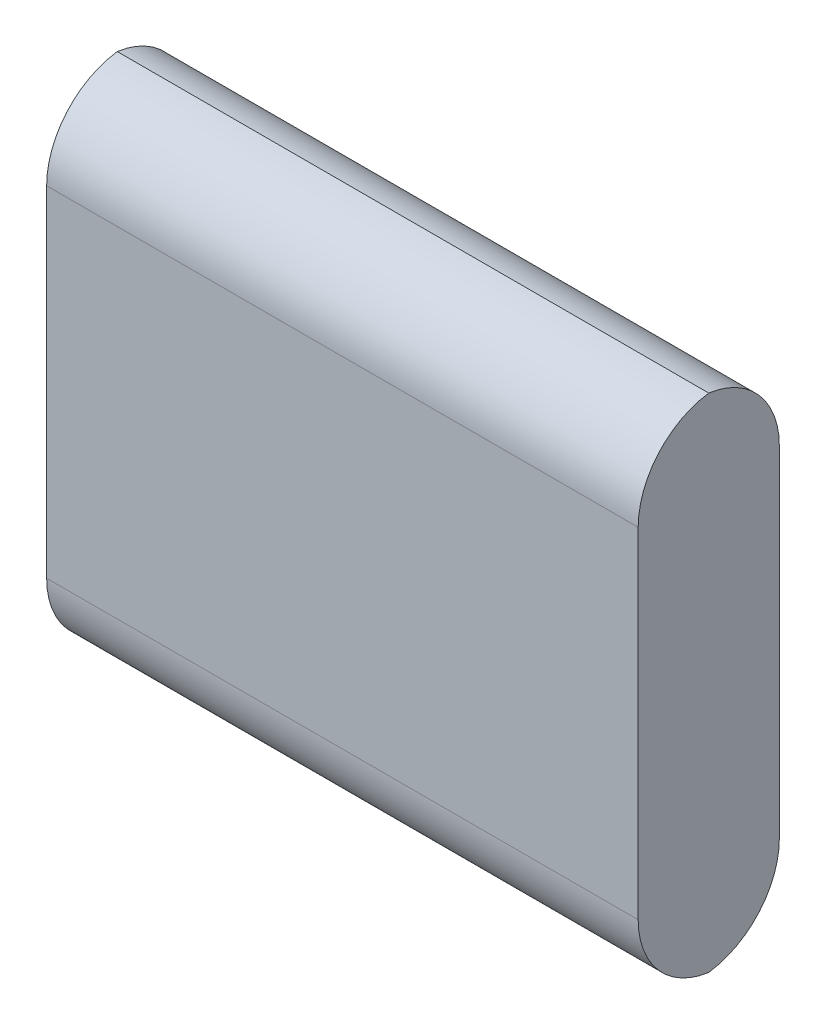
ISO-10303-21;
HEADER;
FILE_DESCRIPTION(('STEP AP214'),'2;1');
FILE_NAME('part.step','',(''),(''),'','','');
FILE_SCHEMA(('AUTOMOTIVE_DESIGN { 1 0 10303 214 1 1 1 1 }'));
ENDSEC;
DATA;
#1=APPLICATION_CONTEXT('core data for automotive mechanical design processes');
#2=APPLICATION_PROTOCOL_DEFINITION('international standard','automotive_design',2000,#1);
#3=PRODUCT_CONTEXT('',#1,'mechanical');
#4=PRODUCT('Part','Part','',(#3));
#5=PRODUCT_RELATED_PRODUCT_CATEGORY('part','',(#4));
#6=PRODUCT_DEFINITION_FORMATION('','',#4);
#7=PRODUCT_DEFINITION_CONTEXT('part definition',#1,'design');
#8=PRODUCT_DEFINITION('design','',#6,#7);
#9=PRODUCT_DEFINITION_SHAPE('','',#8);
#10=(LENGTH_UNIT() NAMED_UNIT(*) SI_UNIT(.MILLI.,.METRE.));
#11=(NAMED_UNIT(*) PLANE_ANGLE_UNIT() SI_UNIT($,.RADIAN.));
#12=(NAMED_UNIT(*) SI_UNIT($,.STERADIAN.) SOLID_ANGLE_UNIT());
#13=UNCERTAINTY_MEASURE_WITH_UNIT(LENGTH_MEASURE(1.E-05),#10,'distance_accuracy_value','');
#14=(GEOMETRIC_REPRESENTATION_CONTEXT(3) GLOBAL_UNCERTAINTY_ASSIGNED_CONTEXT((#13)) GLOBAL_UNIT_ASSIGNED_CONTEXT((#10,
#11,#12)) REPRESENTATION_CONTEXT('',''));
#15=CARTESIAN_POINT('',(0.,0.,0.));
#16=DIRECTION('',(0.,0.,1.));
#17=DIRECTION('',(1.,0.,0.));
#18=AXIS2_PLACEMENT_3D('',#15,#16,#17);
#19=CARTESIAN_POINT('',(-45.25,38.5,21.6));
#20=DIRECTION('',(1.,0.,0.));
#21=DIRECTION('',(0.,1.,0.));
#22=AXIS2_PLACEMENT_3D('',#19,#20,#21);
#23=PLANE('',#22);
#24=DIRECTION('',(0.,-1.,0.));
#25=VECTOR('',#24,1.);
#26=CARTESIAN_POINT('',(-45.25,38.5,0.));
#27=LINE('',#26,#25);
#28=CARTESIAN_POINT('',(-45.25,26.,0.));
#29=VERTEX_POINT('',#28);
#30=CARTESIAN_POINT('',(-45.25,-26.,0.));
#31=VERTEX_POINT('',#30);
#32=EDGE_CURVE('E108',#29,#31,#27,.T.);
#33=ORIENTED_EDGE('',*,*,#32,.T.);
#34=CARTESIAN_POINT('',(-45.25,-26.,12.5));
#35=DIRECTION('',(1.,0.,0.));
#36=DIRECTION('',(0.,1.,0.));
#37=AXIS2_PLACEMENT_3D('',#34,#35,#36);
#38=CIRCLE('',#37,12.5);
#39=CARTESIAN_POINT('',(-45.25,-38.3838604643302,10.8));
#40=VERTEX_POINT('',#39);
#41=EDGE_CURVE('E50',#31,#40,#38,.F.);
#42=ORIENTED_EDGE('',*,*,#41,.T.);
#43=CARTESIAN_POINT('',(-45.25,-26.,9.1));
#44=DIRECTION('',(1.,0.,0.));
#45=DIRECTION('',(0.,1.,0.));
#46=AXIS2_PLACEMENT_3D('',#43,#44,#45);
#47=CIRCLE('',#46,12.5);
#48=CARTESIAN_POINT('',(-45.25,-26.,21.6));
#49=VERTEX_POINT('',#48);
#50=EDGE_CURVE('E117',#40,#49,#47,.F.);
#51=ORIENTED_EDGE('',*,*,#50,.T.);
#52=DIRECTION('',(0.,-1.,0.));
#53=VECTOR('',#52,1.);
#54=CARTESIAN_POINT('',(-45.25,38.5,21.6));
#55=LINE('',#54,#53);
#56=CARTESIAN_POINT('',(-45.25,26.,21.6));
#57=VERTEX_POINT('',#56);
#58=EDGE_CURVE('E107',#57,#49,#55,.T.);
#59=ORIENTED_EDGE('',*,*,#58,.F.);
#60=CARTESIAN_POINT('',(-45.25,26.,9.1));
#61=DIRECTION('',(1.,0.,0.));
#62=DIRECTION('',(0.,1.,0.));
#63=AXIS2_PLACEMENT_3D('',#60,#61,#62);
#64=CIRCLE('',#63,12.5);
#65=CARTESIAN_POINT('',(-45.25,38.3838604643302,10.8));
#66=VERTEX_POINT('',#65);
#67=EDGE_CURVE('E57',#57,#66,#64,.F.);
#68=ORIENTED_EDGE('',*,*,#67,.T.);
#69=CARTESIAN_POINT('',(-45.25,26.,12.5));
#70=DIRECTION('',(1.,0.,0.));
#71=DIRECTION('',(0.,1.,0.));
#72=AXIS2_PLACEMENT_3D('',#69,#70,#71);
#73=CIRCLE('',#72,12.5);
#74=EDGE_CURVE('E112',#66,#29,#73,.F.);
#75=ORIENTED_EDGE('',*,*,#74,.T.);
#76=EDGE_LOOP('',(#33,#42,#51,#59,#68,#75));
#77=FACE_BOUND('',#76,.T.);
#78=ADVANCED_FACE('F33',(#77),#23,.F.);
#79=CARTESIAN_POINT('',(45.25,38.5,21.6));
#80=DIRECTION('',(-1.,0.,0.));
#81=DIRECTION('',(0.,-1.,0.));
#82=AXIS2_PLACEMENT_3D('',#79,#80,#81);
#83=PLANE('',#82);
#84=CARTESIAN_POINT('',(45.25,-26.,9.1));
#85=DIRECTION('',(-1.,0.,0.));
#86=DIRECTION('',(0.,-1.,0.));
#87=AXIS2_PLACEMENT_3D('',#84,#85,#86);
#88=CIRCLE('',#87,12.5);
#89=CARTESIAN_POINT('',(45.25,-26.,21.6));
#90=VERTEX_POINT('',#89);
#91=CARTESIAN_POINT('',(45.25,-38.3838604643302,10.8));
#92=VERTEX_POINT('',#91);
#93=EDGE_CURVE('E93',#90,#92,#88,.F.);
#94=ORIENTED_EDGE('',*,*,#93,.T.);
#95=CARTESIAN_POINT('',(45.25,-26.,12.5));
#96=DIRECTION('',(-1.,0.,0.));
#97=DIRECTION('',(0.,-1.,0.));
#98=AXIS2_PLACEMENT_3D('',#95,#96,#97);
#99=CIRCLE('',#98,12.5);
#100=CARTESIAN_POINT('',(45.25,-26.,0.));
#101=VERTEX_POINT('',#100);
#102=EDGE_CURVE('E87',#92,#101,#99,.F.);
#103=ORIENTED_EDGE('',*,*,#102,.T.);
#104=DIRECTION('',(0.,1.,0.));
#105=VECTOR('',#104,1.);
#106=CARTESIAN_POINT('',(45.25,38.5,0.));
#107=LINE('',#106,#105);
#108=CARTESIAN_POINT('',(45.25,26.,0.));
#109=VERTEX_POINT('',#108);
#110=EDGE_CURVE('E90',#101,#109,#107,.T.);
#111=ORIENTED_EDGE('',*,*,#110,.T.);
#112=CARTESIAN_POINT('',(45.25,26.,12.5));
#113=DIRECTION('',(-1.,0.,0.));
#114=DIRECTION('',(0.,-1.,0.));
#115=AXIS2_PLACEMENT_3D('',#112,#113,#114);
#116=CIRCLE('',#115,12.5);
#117=CARTESIAN_POINT('',(45.25,38.3838604643302,10.8));
#118=VERTEX_POINT('',#117);
#119=EDGE_CURVE('E126',#109,#118,#116,.F.);
#120=ORIENTED_EDGE('',*,*,#119,.T.);
#121=CARTESIAN_POINT('',(45.25,26.,9.1));
#122=DIRECTION('',(-1.,0.,0.));
#123=DIRECTION('',(0.,-1.,0.));
#124=AXIS2_PLACEMENT_3D('',#121,#122,#123);
#125=CIRCLE('',#124,12.5);
#126=CARTESIAN_POINT('',(45.25,26.,21.6));
#127=VERTEX_POINT('',#126);
#128=EDGE_CURVE('E130',#118,#127,#125,.F.);
#129=ORIENTED_EDGE('',*,*,#128,.T.);
#130=DIRECTION('',(0.,1.,0.));
#131=VECTOR('',#130,1.);
#132=CARTESIAN_POINT('',(45.25,38.5,21.6));
#133=LINE('',#132,#131);
#134=EDGE_CURVE('E132',#90,#127,#133,.T.);
#135=ORIENTED_EDGE('',*,*,#134,.F.);
#136=EDGE_LOOP('',(#94,#103,#111,#120,#129,#135));
#137=FACE_BOUND('',#136,.T.);
#138=ADVANCED_FACE('F89',(#137),#83,.F.);
#139=CARTESIAN_POINT('',(0.,0.,21.6));
#140=DIRECTION('',(0.,0.,-1.));
#141=DIRECTION('',(-1.,0.,0.));
#142=AXIS2_PLACEMENT_3D('',#139,#140,#141);
#143=PLANE('',#142);
#144=ORIENTED_EDGE('',*,*,#58,.T.);
#145=DIRECTION('',(1.,0.,0.));
#146=VECTOR('',#145,1.);
#147=CARTESIAN_POINT('',(0.,-26.,21.6));
#148=LINE('',#147,#146);
#149=EDGE_CURVE('E11',#49,#90,#148,.T.);
#150=ORIENTED_EDGE('',*,*,#149,.T.);
#151=ORIENTED_EDGE('',*,*,#134,.T.);
#152=DIRECTION('',(-1.,0.,0.));
#153=VECTOR('',#152,1.);
#154=CARTESIAN_POINT('',(0.,26.,21.6));
#155=LINE('',#154,#153);
#156=EDGE_CURVE('E42',#127,#57,#155,.T.);
#157=ORIENTED_EDGE('',*,*,#156,.T.);
#158=EDGE_LOOP('',(#144,#150,#151,#157));
#159=FACE_BOUND('',#158,.T.);
#160=ADVANCED_FACE('F141',(#159),#143,.F.);
#161=CARTESIAN_POINT('',(0.,0.,0.));
#162=DIRECTION('',(0.,0.,-1.));
#163=DIRECTION('',(-1.,0.,0.));
#164=AXIS2_PLACEMENT_3D('',#161,#162,#163);
#165=PLANE('',#164);
#166=ORIENTED_EDGE('',*,*,#110,.F.);
#167=DIRECTION('',(1.,0.,0.));
#168=VECTOR('',#167,1.);
#169=CARTESIAN_POINT('',(-45.25,-26.,0.));
#170=LINE('',#169,#168);
#171=EDGE_CURVE('E105',#101,#31,#170,.F.);
#172=ORIENTED_EDGE('',*,*,#171,.T.);
#173=ORIENTED_EDGE('',*,*,#32,.F.);
#174=DIRECTION('',(-1.,0.,0.));
#175=VECTOR('',#174,1.);
#176=CARTESIAN_POINT('',(45.25,26.,0.));
#177=LINE('',#176,#175);
#178=EDGE_CURVE('E98',#29,#109,#177,.F.);
#179=ORIENTED_EDGE('',*,*,#178,.T.);
#180=EDGE_LOOP('',(#166,#172,#173,#179));
#181=FACE_BOUND('',#180,.T.);
#182=ADVANCED_FACE('F103',(#181),#165,.T.);
#183=CARTESIAN_POINT('',(0.,-26.,9.1));
#184=DIRECTION('',(1.,0.,0.));
#185=DIRECTION('',(0.,1.,0.));
#186=AXIS2_PLACEMENT_3D('',#183,#184,#185);
#187=CYLINDRICAL_SURFACE('',#186,12.5);
#188=ORIENTED_EDGE('',*,*,#149,.F.);
#189=ORIENTED_EDGE('',*,*,#50,.F.);
#190=DIRECTION('',(1.,0.,0.));
#191=VECTOR('',#190,1.);
#192=CARTESIAN_POINT('',(0.,-38.3838604643302,10.8));
#193=LINE('',#192,#191);
#194=EDGE_CURVE('E120',#92,#40,#193,.F.);
#195=ORIENTED_EDGE('',*,*,#194,.F.);
#196=ORIENTED_EDGE('',*,*,#93,.F.);
#197=EDGE_LOOP('',(#188,#189,#195,#196));
#198=FACE_BOUND('',#197,.T.);
#199=ADVANCED_FACE('F143',(#198),#187,.T.);
#200=CARTESIAN_POINT('',(45.25,-26.,12.5));
#201=DIRECTION('',(-1.,0.,0.));
#202=DIRECTION('',(0.,-1.,0.));
#203=AXIS2_PLACEMENT_3D('',#200,#201,#202);
#204=CYLINDRICAL_SURFACE('',#203,12.5);
#205=ORIENTED_EDGE('',*,*,#41,.F.);
#206=ORIENTED_EDGE('',*,*,#171,.F.);
#207=ORIENTED_EDGE('',*,*,#102,.F.);
#208=ORIENTED_EDGE('',*,*,#194,.T.);
#209=EDGE_LOOP('',(#205,#206,#207,#208));
#210=FACE_BOUND('',#209,.T.);
#211=ADVANCED_FACE('F110',(#210),#204,.T.);
#212=CARTESIAN_POINT('',(0.,26.,9.1));
#213=DIRECTION('',(-1.,0.,0.));
#214=DIRECTION('',(0.,-1.,0.));
#215=AXIS2_PLACEMENT_3D('',#212,#213,#214);
#216=CYLINDRICAL_SURFACE('',#215,12.5);
#217=ORIENTED_EDGE('',*,*,#156,.F.);
#218=ORIENTED_EDGE('',*,*,#128,.F.);
#219=DIRECTION('',(-1.,0.,0.));
#220=VECTOR('',#219,1.);
#221=CARTESIAN_POINT('',(0.,38.3838604643302,10.8));
#222=LINE('',#221,#220);
#223=EDGE_CURVE('E37',#66,#118,#222,.F.);
#224=ORIENTED_EDGE('',*,*,#223,.F.);
#225=ORIENTED_EDGE('',*,*,#67,.F.);
#226=EDGE_LOOP('',(#217,#218,#224,#225));
#227=FACE_BOUND('',#226,.T.);
#228=ADVANCED_FACE('F35',(#227),#216,.T.);
#229=CARTESIAN_POINT('',(45.25,26.,12.5));
#230=DIRECTION('',(1.,0.,0.));
#231=DIRECTION('',(0.,1.,0.));
#232=AXIS2_PLACEMENT_3D('',#229,#230,#231);
#233=CYLINDRICAL_SURFACE('',#232,12.5);
#234=ORIENTED_EDGE('',*,*,#119,.F.);
#235=ORIENTED_EDGE('',*,*,#178,.F.);
#236=ORIENTED_EDGE('',*,*,#74,.F.);
#237=ORIENTED_EDGE('',*,*,#223,.T.);
#238=EDGE_LOOP('',(#234,#235,#236,#237));
#239=FACE_BOUND('',#238,.T.);
#240=ADVANCED_FACE('F125',(#239),#233,.T.);
#241=CLOSED_SHELL('',(#78,#138,#160,#182,#199,#211,#228,#240));
#242=MANIFOLD_SOLID_BREP('B2',#241);
#243=ADVANCED_BREP_SHAPE_REPRESENTATION('',(#18,#242),#14);
#244=SHAPE_DEFINITION_REPRESENTATION(#9,#243);
ENDSEC;
END-ISO-10303-21;
